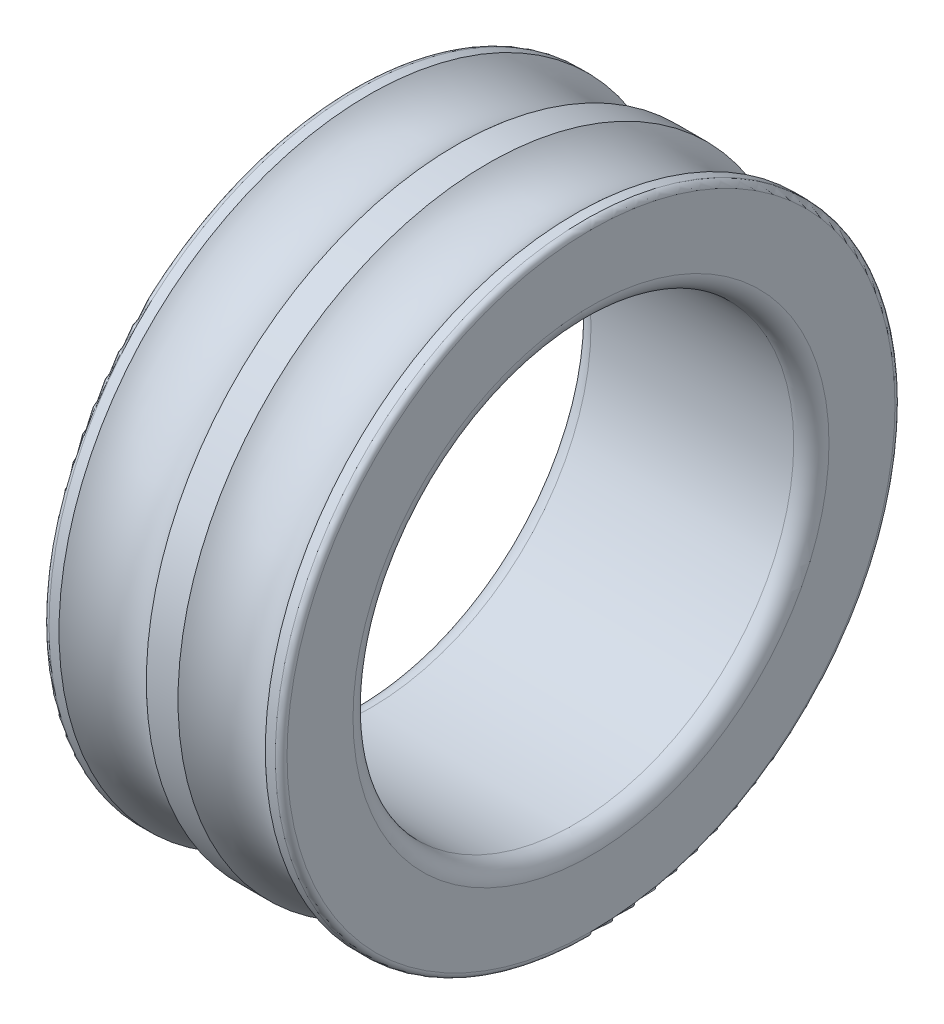
ISO-10303-21;
HEADER;
FILE_DESCRIPTION(('STEP AP214'),'2;1');
FILE_NAME('part.step','',(''),(''),'','','');
FILE_SCHEMA(('AUTOMOTIVE_DESIGN { 1 0 10303 214 1 1 1 1 }'));
ENDSEC;
DATA;
#1=APPLICATION_CONTEXT('core data for automotive mechanical design processes');
#2=APPLICATION_PROTOCOL_DEFINITION('international standard','automotive_design',2000,#1);
#3=PRODUCT_CONTEXT('',#1,'mechanical');
#4=PRODUCT('Part','Part','',(#3));
#5=PRODUCT_RELATED_PRODUCT_CATEGORY('part','',(#4));
#6=PRODUCT_DEFINITION_FORMATION('','',#4);
#7=PRODUCT_DEFINITION_CONTEXT('part definition',#1,'design');
#8=PRODUCT_DEFINITION('design','',#6,#7);
#9=PRODUCT_DEFINITION_SHAPE('','',#8);
#10=(LENGTH_UNIT() NAMED_UNIT(*) SI_UNIT(.MILLI.,.METRE.));
#11=(NAMED_UNIT(*) PLANE_ANGLE_UNIT() SI_UNIT($,.RADIAN.));
#12=(NAMED_UNIT(*) SI_UNIT($,.STERADIAN.) SOLID_ANGLE_UNIT());
#13=UNCERTAINTY_MEASURE_WITH_UNIT(LENGTH_MEASURE(1.E-05),#10,'distance_accuracy_value','');
#14=(GEOMETRIC_REPRESENTATION_CONTEXT(3) GLOBAL_UNCERTAINTY_ASSIGNED_CONTEXT((#13)) GLOBAL_UNIT_ASSIGNED_CONTEXT((#10,
#11,#12)) REPRESENTATION_CONTEXT('',''));
#15=CARTESIAN_POINT('',(0.,0.,0.));
#16=DIRECTION('',(0.,0.,1.));
#17=DIRECTION('',(1.,0.,0.));
#18=AXIS2_PLACEMENT_3D('',#15,#16,#17);
#19=CARTESIAN_POINT('',(6.75,0.,0.));
#20=DIRECTION('',(1.,0.,0.));
#21=DIRECTION('',(0.,0.,-1.));
#22=AXIS2_PLACEMENT_3D('',#19,#20,#21);
#23=TOROIDAL_SURFACE('',#22,40.2995,7.14400000000007);
#24=CARTESIAN_POINT('',(1.798294662442,0.,0.));
#25=DIRECTION('',(1.,0.,0.));
#26=DIRECTION('',(0.,0.,-1.));
#27=AXIS2_PLACEMENT_3D('',#24,#25,#26);
#28=CIRCLE('',#27,35.1499999999999);
#29=CARTESIAN_POINT('',(1.798294662442,0.,-35.1499999999999));
#30=VERTEX_POINT('',#29);
#31=EDGE_CURVE('E78',#30,#30,#28,.T.);
#32=ORIENTED_EDGE('',*,*,#31,.T.);
#33=EDGE_LOOP('',(#32));
#34=FACE_BOUND('',#33,.T.);
#35=CARTESIAN_POINT('',(11.701705337558,0.,0.));
#36=DIRECTION('',(1.,0.,0.));
#37=DIRECTION('',(0.,0.,-1.));
#38=AXIS2_PLACEMENT_3D('',#35,#36,#37);
#39=CIRCLE('',#38,35.1499999999999);
#40=CARTESIAN_POINT('',(11.701705337558,0.,-35.1499999999999));
#41=VERTEX_POINT('',#40);
#42=EDGE_CURVE('E69',#41,#41,#39,.T.);
#43=ORIENTED_EDGE('',*,*,#42,.F.);
#44=EDGE_LOOP('',(#43));
#45=FACE_BOUND('',#44,.T.);
#46=ADVANCED_FACE('F37',(#34,#45),#23,.F.);
#47=CARTESIAN_POINT('',(0.,0.,0.));
#48=DIRECTION('',(1.,0.,0.));
#49=DIRECTION('',(0.,0.,-1.));
#50=AXIS2_PLACEMENT_3D('',#47,#48,#49);
#51=CYLINDRICAL_SURFACE('',#50,35.15);
#52=ORIENTED_EDGE('',*,*,#42,.T.);
#53=EDGE_LOOP('',(#52));
#54=FACE_BOUND('',#53,.T.);
#55=CARTESIAN_POINT('',(15.298294662442,0.,0.));
#56=DIRECTION('',(1.,0.,0.));
#57=DIRECTION('',(0.,0.,-1.));
#58=AXIS2_PLACEMENT_3D('',#55,#56,#57);
#59=CIRCLE('',#58,35.15);
#60=CARTESIAN_POINT('',(15.298294662442,0.,-35.15));
#61=VERTEX_POINT('',#60);
#62=EDGE_CURVE('E72',#61,#61,#59,.T.);
#63=ORIENTED_EDGE('',*,*,#62,.F.);
#64=EDGE_LOOP('',(#63));
#65=FACE_BOUND('',#64,.T.);
#66=ADVANCED_FACE('F101',(#54,#65),#51,.T.);
#67=CARTESIAN_POINT('',(20.25,0.,0.));
#68=DIRECTION('',(1.,0.,0.));
#69=DIRECTION('',(0.,0.,-1.));
#70=AXIS2_PLACEMENT_3D('',#67,#68,#69);
#71=TOROIDAL_SURFACE('',#70,40.2995,7.14400000000005);
#72=ORIENTED_EDGE('',*,*,#62,.T.);
#73=EDGE_LOOP('',(#72));
#74=FACE_BOUND('',#73,.T.);
#75=CARTESIAN_POINT('',(25.201705337558,0.,0.));
#76=DIRECTION('',(1.,0.,0.));
#77=DIRECTION('',(0.,0.,-1.));
#78=AXIS2_PLACEMENT_3D('',#75,#76,#77);
#79=CIRCLE('',#78,35.1499999999999);
#80=CARTESIAN_POINT('',(25.201705337558,0.,-35.1499999999999));
#81=VERTEX_POINT('',#80);
#82=EDGE_CURVE('E75',#81,#81,#79,.T.);
#83=ORIENTED_EDGE('',*,*,#82,.F.);
#84=EDGE_LOOP('',(#83));
#85=FACE_BOUND('',#84,.T.);
#86=ADVANCED_FACE('F106',(#74,#85),#71,.F.);
#87=CARTESIAN_POINT('',(0.,0.,0.));
#88=DIRECTION('',(1.,0.,0.));
#89=DIRECTION('',(0.,0.,-1.));
#90=AXIS2_PLACEMENT_3D('',#87,#88,#89);
#91=CYLINDRICAL_SURFACE('',#90,35.15);
#92=CARTESIAN_POINT('',(26.3333333333321,0.,0.));
#93=DIRECTION('',(1.,0.,0.));
#94=DIRECTION('',(0.,0.,-1.));
#95=AXIS2_PLACEMENT_3D('',#92,#93,#94);
#96=CIRCLE('',#95,35.15);
#97=CARTESIAN_POINT('',(26.3333333333321,0.,-35.15));
#98=VERTEX_POINT('',#97);
#99=EDGE_CURVE('E10',#98,#98,#96,.F.);
#100=ORIENTED_EDGE('',*,*,#99,.T.);
#101=EDGE_LOOP('',(#100));
#102=FACE_BOUND('',#101,.T.);
#103=ORIENTED_EDGE('',*,*,#82,.T.);
#104=EDGE_LOOP('',(#103));
#105=FACE_BOUND('',#104,.T.);
#106=ADVANCED_FACE('F157',(#102,#105),#91,.T.);
#107=CARTESIAN_POINT('',(27.,25.,0.));
#108=DIRECTION('',(1.,0.,0.));
#109=DIRECTION('',(0.,0.,-1.));
#110=AXIS2_PLACEMENT_3D('',#107,#108,#109);
#111=PLANE('',#110);
#112=CARTESIAN_POINT('',(27.,0.,0.));
#113=DIRECTION('',(1.,0.,0.));
#114=DIRECTION('',(0.,0.,-1.));
#115=AXIS2_PLACEMENT_3D('',#112,#113,#114);
#116=CIRCLE('',#115,34.4833333333321);
#117=CARTESIAN_POINT('',(27.,0.,-34.4833333333321));
#118=VERTEX_POINT('',#117);
#119=EDGE_CURVE('E44',#118,#118,#116,.T.);
#120=ORIENTED_EDGE('',*,*,#119,.T.);
#121=EDGE_LOOP('',(#120));
#122=FACE_BOUND('',#121,.T.);
#123=CARTESIAN_POINT('',(27.,0.,0.));
#124=DIRECTION('',(1.,0.,0.));
#125=DIRECTION('',(0.,0.,-1.));
#126=AXIS2_PLACEMENT_3D('',#123,#124,#125);
#127=CIRCLE('',#126,27.0000000000003);
#128=CARTESIAN_POINT('',(27.,0.,-27.0000000000003));
#129=VERTEX_POINT('',#128);
#130=EDGE_CURVE('E57',#129,#129,#127,.F.);
#131=ORIENTED_EDGE('',*,*,#130,.T.);
#132=EDGE_LOOP('',(#131));
#133=FACE_BOUND('',#132,.T.);
#134=ADVANCED_FACE('F152',(#122,#133),#111,.T.);
#135=CARTESIAN_POINT('',(0.,0.,0.));
#136=DIRECTION('',(1.,0.,0.));
#137=DIRECTION('',(0.,0.,-1.));
#138=AXIS2_PLACEMENT_3D('',#135,#136,#137);
#139=CYLINDRICAL_SURFACE('',#138,25.);
#140=CARTESIAN_POINT('',(2.00000000000032,0.,0.));
#141=DIRECTION('',(-1.,0.,0.));
#142=DIRECTION('',(0.,0.,1.));
#143=AXIS2_PLACEMENT_3D('',#140,#141,#142);
#144=CIRCLE('',#143,25.);
#145=CARTESIAN_POINT('',(2.00000000000032,0.,25.));
#146=VERTEX_POINT('',#145);
#147=EDGE_CURVE('E60',#146,#146,#144,.T.);
#148=ORIENTED_EDGE('',*,*,#147,.T.);
#149=EDGE_LOOP('',(#148));
#150=FACE_BOUND('',#149,.T.);
#151=CARTESIAN_POINT('',(24.9999999999997,0.,0.));
#152=DIRECTION('',(1.,0.,0.));
#153=DIRECTION('',(0.,0.,-1.));
#154=AXIS2_PLACEMENT_3D('',#151,#152,#153);
#155=CIRCLE('',#154,25.);
#156=CARTESIAN_POINT('',(24.9999999999997,0.,-25.));
#157=VERTEX_POINT('',#156);
#158=EDGE_CURVE('E63',#157,#157,#155,.T.);
#159=ORIENTED_EDGE('',*,*,#158,.T.);
#160=EDGE_LOOP('',(#159));
#161=FACE_BOUND('',#160,.T.);
#162=ADVANCED_FACE('F97',(#150,#161),#139,.F.);
#163=CARTESIAN_POINT('',(0.,35.15,0.));
#164=DIRECTION('',(-1.,0.,0.));
#165=DIRECTION('',(0.,0.,1.));
#166=AXIS2_PLACEMENT_3D('',#163,#164,#165);
#167=PLANE('',#166);
#168=CARTESIAN_POINT('',(0.,0.,0.));
#169=DIRECTION('',(-1.,0.,0.));
#170=DIRECTION('',(0.,0.,1.));
#171=AXIS2_PLACEMENT_3D('',#168,#169,#170);
#172=CIRCLE('',#171,34.4833333333321);
#173=CARTESIAN_POINT('',(0.,0.,34.4833333333321));
#174=VERTEX_POINT('',#173);
#175=EDGE_CURVE('E48',#174,#174,#172,.T.);
#176=ORIENTED_EDGE('',*,*,#175,.T.);
#177=EDGE_LOOP('',(#176));
#178=FACE_BOUND('',#177,.T.);
#179=CARTESIAN_POINT('',(0.,0.,0.));
#180=DIRECTION('',(-1.,0.,0.));
#181=DIRECTION('',(0.,0.,1.));
#182=AXIS2_PLACEMENT_3D('',#179,#180,#181);
#183=CIRCLE('',#182,27.0000000000003);
#184=CARTESIAN_POINT('',(0.,0.,27.0000000000003));
#185=VERTEX_POINT('',#184);
#186=EDGE_CURVE('E66',#185,#185,#183,.F.);
#187=ORIENTED_EDGE('',*,*,#186,.T.);
#188=EDGE_LOOP('',(#187));
#189=FACE_BOUND('',#188,.T.);
#190=ADVANCED_FACE('F87',(#178,#189),#167,.T.);
#191=CARTESIAN_POINT('',(0.,0.,0.));
#192=DIRECTION('',(1.,0.,0.));
#193=DIRECTION('',(0.,0.,-1.));
#194=AXIS2_PLACEMENT_3D('',#191,#192,#193);
#195=CYLINDRICAL_SURFACE('',#194,35.15);
#196=CARTESIAN_POINT('',(0.666666666667912,0.,0.));
#197=DIRECTION('',(-1.,0.,0.));
#198=DIRECTION('',(0.,0.,1.));
#199=AXIS2_PLACEMENT_3D('',#196,#197,#198);
#200=CIRCLE('',#199,35.15);
#201=CARTESIAN_POINT('',(0.666666666667912,0.,35.15));
#202=VERTEX_POINT('',#201);
#203=EDGE_CURVE('E52',#202,#202,#200,.F.);
#204=ORIENTED_EDGE('',*,*,#203,.T.);
#205=EDGE_LOOP('',(#204));
#206=FACE_BOUND('',#205,.T.);
#207=ORIENTED_EDGE('',*,*,#31,.F.);
#208=EDGE_LOOP('',(#207));
#209=FACE_BOUND('',#208,.T.);
#210=ADVANCED_FACE('F84',(#206,#209),#195,.T.);
#211=CARTESIAN_POINT('',(2.00000000000032,0.,0.));
#212=DIRECTION('',(-1.,0.,0.));
#213=DIRECTION('',(0.,0.,1.));
#214=AXIS2_PLACEMENT_3D('',#211,#212,#213);
#215=TOROIDAL_SURFACE('',#214,27.0000000000003,2.00000000000032);
#216=ORIENTED_EDGE('',*,*,#147,.F.);
#217=EDGE_LOOP('',(#216));
#218=FACE_BOUND('',#217,.T.);
#219=ORIENTED_EDGE('',*,*,#186,.F.);
#220=EDGE_LOOP('',(#219));
#221=FACE_BOUND('',#220,.T.);
#222=ADVANCED_FACE('F86',(#218,#221),#215,.T.);
#223=CARTESIAN_POINT('',(24.9999999999997,0.,0.));
#224=DIRECTION('',(1.,0.,0.));
#225=DIRECTION('',(0.,0.,-1.));
#226=AXIS2_PLACEMENT_3D('',#223,#224,#225);
#227=TOROIDAL_SURFACE('',#226,27.0000000000003,2.00000000000032);
#228=ORIENTED_EDGE('',*,*,#130,.F.);
#229=EDGE_LOOP('',(#228));
#230=FACE_BOUND('',#229,.T.);
#231=ORIENTED_EDGE('',*,*,#158,.F.);
#232=EDGE_LOOP('',(#231));
#233=FACE_BOUND('',#232,.T.);
#234=ADVANCED_FACE('F94',(#230,#233),#227,.T.);
#235=CARTESIAN_POINT('',(0.666666666667912,0.,0.));
#236=DIRECTION('',(-1.,0.,0.));
#237=DIRECTION('',(0.,0.,1.));
#238=AXIS2_PLACEMENT_3D('',#235,#236,#237);
#239=TOROIDAL_SURFACE('',#238,34.4833333333321,0.666666666667912);
#240=ORIENTED_EDGE('',*,*,#175,.F.);
#241=EDGE_LOOP('',(#240));
#242=FACE_BOUND('',#241,.T.);
#243=ORIENTED_EDGE('',*,*,#203,.F.);
#244=EDGE_LOOP('',(#243));
#245=FACE_BOUND('',#244,.T.);
#246=ADVANCED_FACE('F112',(#242,#245),#239,.T.);
#247=CARTESIAN_POINT('',(26.3333333333321,0.,0.));
#248=DIRECTION('',(1.,0.,0.));
#249=DIRECTION('',(0.,0.,-1.));
#250=AXIS2_PLACEMENT_3D('',#247,#248,#249);
#251=TOROIDAL_SURFACE('',#250,34.4833333333321,0.666666666667912);
#252=ORIENTED_EDGE('',*,*,#99,.F.);
#253=EDGE_LOOP('',(#252));
#254=FACE_BOUND('',#253,.T.);
#255=ORIENTED_EDGE('',*,*,#119,.F.);
#256=EDGE_LOOP('',(#255));
#257=FACE_BOUND('',#256,.T.);
#258=ADVANCED_FACE('F39',(#254,#257),#251,.T.);
#259=CLOSED_SHELL('',(#46,#66,#86,#106,#134,#162,#190,#210,#222,#234,#246,#258));
#260=MANIFOLD_SOLID_BREP('B2',#259);
#261=ADVANCED_BREP_SHAPE_REPRESENTATION('',(#18,#260),#14);
#262=SHAPE_DEFINITION_REPRESENTATION(#9,#261);
ENDSEC;
END-ISO-10303-21;
